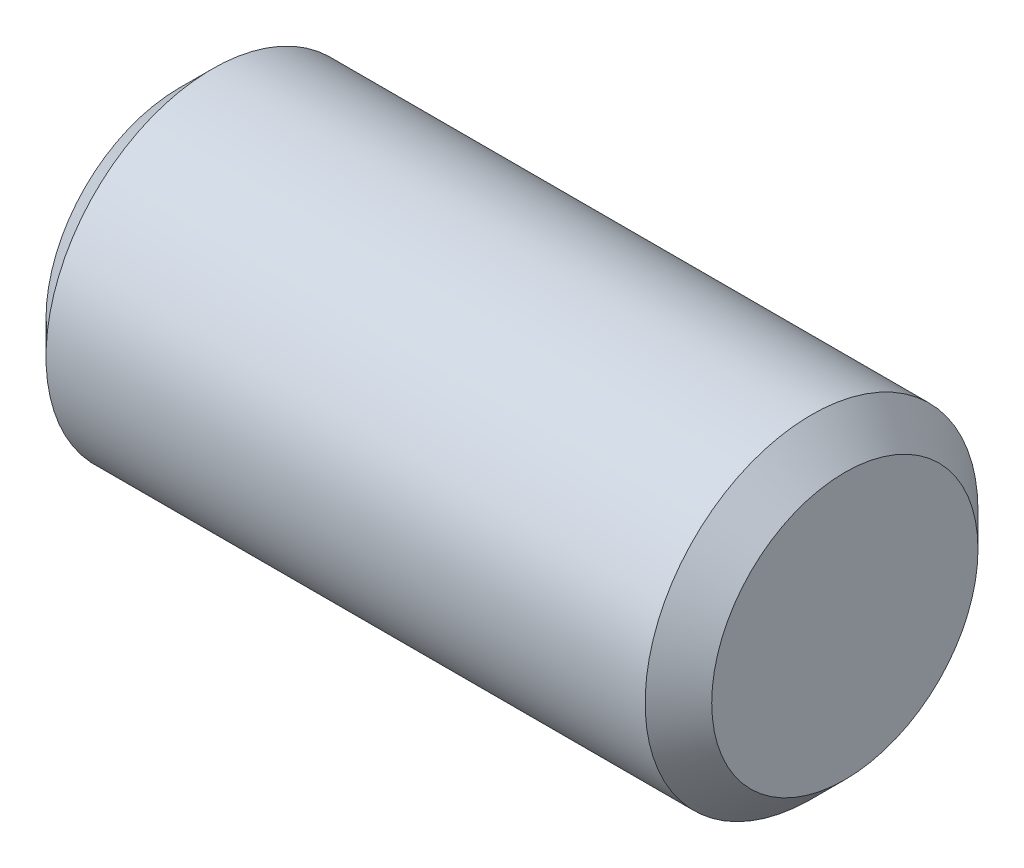
ISO-10303-21;
HEADER;
FILE_DESCRIPTION(('STEP AP214'),'2;1');
FILE_NAME('part.step','',(''),(''),'','','');
FILE_SCHEMA(('AUTOMOTIVE_DESIGN { 1 0 10303 214 1 1 1 1 }'));
ENDSEC;
DATA;
#1=APPLICATION_CONTEXT('core data for automotive mechanical design processes');
#2=APPLICATION_PROTOCOL_DEFINITION('international standard','automotive_design',2000,#1);
#3=PRODUCT_CONTEXT('',#1,'mechanical');
#4=PRODUCT('Part','Part','',(#3));
#5=PRODUCT_RELATED_PRODUCT_CATEGORY('part','',(#4));
#6=PRODUCT_DEFINITION_FORMATION('','',#4);
#7=PRODUCT_DEFINITION_CONTEXT('part definition',#1,'design');
#8=PRODUCT_DEFINITION('design','',#6,#7);
#9=PRODUCT_DEFINITION_SHAPE('','',#8);
#10=(LENGTH_UNIT() NAMED_UNIT(*) SI_UNIT(.MILLI.,.METRE.));
#11=(NAMED_UNIT(*) PLANE_ANGLE_UNIT() SI_UNIT($,.RADIAN.));
#12=(NAMED_UNIT(*) SI_UNIT($,.STERADIAN.) SOLID_ANGLE_UNIT());
#13=UNCERTAINTY_MEASURE_WITH_UNIT(LENGTH_MEASURE(1.E-05),#10,'distance_accuracy_value','');
#14=(GEOMETRIC_REPRESENTATION_CONTEXT(3) GLOBAL_UNCERTAINTY_ASSIGNED_CONTEXT((#13)) GLOBAL_UNIT_ASSIGNED_CONTEXT((#10,
#11,#12)) REPRESENTATION_CONTEXT('',''));
#15=CARTESIAN_POINT('',(0.,0.,0.));
#16=DIRECTION('',(0.,0.,1.));
#17=DIRECTION('',(1.,0.,0.));
#18=AXIS2_PLACEMENT_3D('',#15,#16,#17);
#19=CARTESIAN_POINT('',(-6.,0.,0.));
#20=DIRECTION('',(1.,0.,0.));
#21=DIRECTION('',(0.,0.,-1.));
#22=AXIS2_PLACEMENT_3D('',#19,#20,#21);
#23=CYLINDRICAL_SURFACE('',#22,3.);
#24=CARTESIAN_POINT('',(-5.4,0.,0.));
#25=DIRECTION('',(1.,0.,0.));
#26=DIRECTION('',(0.,0.,-1.));
#27=AXIS2_PLACEMENT_3D('',#24,#25,#26);
#28=CIRCLE('',#27,3.);
#29=CARTESIAN_POINT('',(-5.4,0.,-3.));
#30=VERTEX_POINT('',#29);
#31=EDGE_CURVE('E41',#30,#30,#28,.T.);
#32=ORIENTED_EDGE('',*,*,#31,.T.);
#33=EDGE_LOOP('',(#32));
#34=FACE_BOUND('',#33,.T.);
#35=CARTESIAN_POINT('',(5.4,0.,0.));
#36=DIRECTION('',(1.,0.,0.));
#37=DIRECTION('',(0.,0.,-1.));
#38=AXIS2_PLACEMENT_3D('',#35,#36,#37);
#39=CIRCLE('',#38,3.);
#40=CARTESIAN_POINT('',(5.4,0.,-3.));
#41=VERTEX_POINT('',#40);
#42=EDGE_CURVE('E45',#41,#41,#39,.F.);
#43=ORIENTED_EDGE('',*,*,#42,.T.);
#44=EDGE_LOOP('',(#43));
#45=FACE_BOUND('',#44,.T.);
#46=ADVANCED_FACE('F30',(#34,#45),#23,.T.);
#47=CARTESIAN_POINT('',(-6.,0.,0.));
#48=DIRECTION('',(1.,0.,0.));
#49=DIRECTION('',(0.,0.,-1.));
#50=AXIS2_PLACEMENT_3D('',#47,#48,#49);
#51=PLANE('',#50);
#52=CARTESIAN_POINT('',(-6.,0.,0.));
#53=DIRECTION('',(1.,0.,0.));
#54=DIRECTION('',(0.,0.,-1.));
#55=AXIS2_PLACEMENT_3D('',#52,#53,#54);
#56=CIRCLE('',#55,2.4);
#57=CARTESIAN_POINT('',(-6.,0.,-2.4));
#58=VERTEX_POINT('',#57);
#59=EDGE_CURVE('E37',#58,#58,#56,.F.);
#60=ORIENTED_EDGE('',*,*,#59,.T.);
#61=EDGE_LOOP('',(#60));
#62=FACE_BOUND('',#61,.T.);
#63=ADVANCED_FACE('F61',(#62),#51,.F.);
#64=CARTESIAN_POINT('',(6.,0.,0.));
#65=DIRECTION('',(1.,0.,0.));
#66=DIRECTION('',(0.,0.,-1.));
#67=AXIS2_PLACEMENT_3D('',#64,#65,#66);
#68=PLANE('',#67);
#69=CARTESIAN_POINT('',(6.,0.,0.));
#70=DIRECTION('',(1.,0.,0.));
#71=DIRECTION('',(0.,0.,-1.));
#72=AXIS2_PLACEMENT_3D('',#69,#70,#71);
#73=CIRCLE('',#72,2.4);
#74=CARTESIAN_POINT('',(6.,0.,-2.4));
#75=VERTEX_POINT('',#74);
#76=EDGE_CURVE('E10',#75,#75,#73,.T.);
#77=ORIENTED_EDGE('',*,*,#76,.T.);
#78=EDGE_LOOP('',(#77));
#79=FACE_BOUND('',#78,.T.);
#80=ADVANCED_FACE('F58',(#79),#68,.T.);
#81=CARTESIAN_POINT('',(-5.4,0.,0.));
#82=DIRECTION('',(1.,0.,0.));
#83=DIRECTION('',(0.,0.,-1.));
#84=AXIS2_PLACEMENT_3D('',#81,#82,#83);
#85=CONICAL_SURFACE('',#84,3.,0.78539816339745);
#86=ORIENTED_EDGE('',*,*,#59,.F.);
#87=EDGE_LOOP('',(#86));
#88=FACE_BOUND('',#87,.T.);
#89=ORIENTED_EDGE('',*,*,#31,.F.);
#90=EDGE_LOOP('',(#89));
#91=FACE_BOUND('',#90,.T.);
#92=ADVANCED_FACE('F54',(#88,#91),#85,.T.);
#93=CARTESIAN_POINT('',(6.,0.,0.));
#94=DIRECTION('',(-1.,0.,0.));
#95=DIRECTION('',(0.,0.,1.));
#96=AXIS2_PLACEMENT_3D('',#93,#94,#95);
#97=CONICAL_SURFACE('',#96,2.4,0.785398163397447);
#98=ORIENTED_EDGE('',*,*,#42,.F.);
#99=EDGE_LOOP('',(#98));
#100=FACE_BOUND('',#99,.T.);
#101=ORIENTED_EDGE('',*,*,#76,.F.);
#102=EDGE_LOOP('',(#101));
#103=FACE_BOUND('',#102,.T.);
#104=ADVANCED_FACE('F32',(#100,#103),#97,.T.);
#105=CLOSED_SHELL('',(#46,#63,#80,#92,#104));
#106=MANIFOLD_SOLID_BREP('B2',#105);
#107=ADVANCED_BREP_SHAPE_REPRESENTATION('',(#18,#106),#14);
#108=SHAPE_DEFINITION_REPRESENTATION(#9,#107);
ENDSEC;
END-ISO-10303-21;
